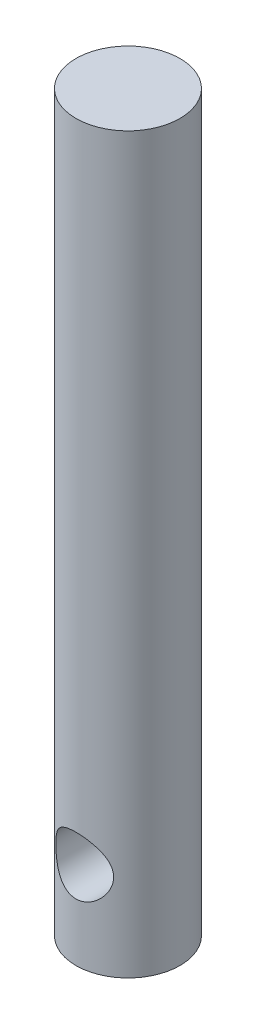
ISO-10303-21;
HEADER;
FILE_DESCRIPTION(('STEP AP214'),'2;1');
FILE_NAME('part.step','',(''),(''),'','','');
FILE_SCHEMA(('AUTOMOTIVE_DESIGN { 1 0 10303 214 1 1 1 1 }'));
ENDSEC;
DATA;
#1=APPLICATION_CONTEXT('core data for automotive mechanical design processes');
#2=APPLICATION_PROTOCOL_DEFINITION('international standard','automotive_design',2000,#1);
#3=PRODUCT_CONTEXT('',#1,'mechanical');
#4=PRODUCT('Part','Part','',(#3));
#5=PRODUCT_RELATED_PRODUCT_CATEGORY('part','',(#4));
#6=PRODUCT_DEFINITION_FORMATION('','',#4);
#7=PRODUCT_DEFINITION_CONTEXT('part definition',#1,'design');
#8=PRODUCT_DEFINITION('design','',#6,#7);
#9=PRODUCT_DEFINITION_SHAPE('','',#8);
#10=(LENGTH_UNIT() NAMED_UNIT(*) SI_UNIT(.MILLI.,.METRE.));
#11=(NAMED_UNIT(*) PLANE_ANGLE_UNIT() SI_UNIT($,.RADIAN.));
#12=(NAMED_UNIT(*) SI_UNIT($,.STERADIAN.) SOLID_ANGLE_UNIT());
#13=UNCERTAINTY_MEASURE_WITH_UNIT(LENGTH_MEASURE(1.E-05),#10,'distance_accuracy_value','');
#14=(GEOMETRIC_REPRESENTATION_CONTEXT(3) GLOBAL_UNCERTAINTY_ASSIGNED_CONTEXT((#13)) GLOBAL_UNIT_ASSIGNED_CONTEXT((#10,
#11,#12)) REPRESENTATION_CONTEXT('',''));
#15=CARTESIAN_POINT('',(0.,0.,0.));
#16=DIRECTION('',(0.,0.,1.));
#17=DIRECTION('',(1.,0.,0.));
#18=AXIS2_PLACEMENT_3D('',#15,#16,#17);
#19=CARTESIAN_POINT('',(32.6665114947379,127.,0.));
#20=DIRECTION('',(0.,-1.,0.));
#21=DIRECTION('',(0.,0.,-1.));
#22=AXIS2_PLACEMENT_3D('',#19,#20,#21);
#23=CYLINDRICAL_SURFACE('',#22,9.);
#24=CARTESIAN_POINT('',(32.6665114947379,20.,-9.));
#25=CARTESIAN_POINT('',(32.5367828446391,20.0000004034984,-9.00000035367436));
#26=CARTESIAN_POINT('',(32.4070594209438,19.9949457291585,-8.99718916475519));
#27=CARTESIAN_POINT('',(32.1485899390427,19.9747929956815,-8.98601661845687));
#28=CARTESIAN_POINT('',(32.0198442406236,19.9596914048975,-8.97765330942365));
#29=CARTESIAN_POINT('',(31.7643966779283,19.9196443065761,-8.95559163133401));
#30=CARTESIAN_POINT('',(31.6376942972219,19.8947013282714,-8.94189463304535));
#31=CARTESIAN_POINT('',(31.3871540239864,19.8352693657243,-8.90950110249539));
#32=CARTESIAN_POINT('',(31.2633173329788,19.800776453257,-8.89080251301058));
#33=CARTESIAN_POINT('',(31.0198672429261,19.7227988187131,-8.8489406066893));
#34=CARTESIAN_POINT('',(30.900238461846,19.6793519723011,-8.82579612337895));
#35=CARTESIAN_POINT('',(30.6653313414804,19.5838168431952,-8.77551906926369));
#36=CARTESIAN_POINT('',(30.5500546628547,19.5317253019913,-8.74838499507351));
#37=CARTESIAN_POINT('',(30.2117227207629,19.3631884503319,-8.66187363770961));
#38=CARTESIAN_POINT('',(29.9959773181274,19.2344198818942,-8.59735346727596));
#39=CARTESIAN_POINT('',(29.5737992038572,18.9378076863466,-8.45507241221886));
#40=CARTESIAN_POINT('',(29.3690573350959,18.7678695156046,-8.37670278285859));
#41=CARTESIAN_POINT('',(28.9893515052516,18.3983538741864,-8.21711406392093));
#42=CARTESIAN_POINT('',(28.814417956795,18.1987465168941,-8.13589216491854));
#43=CARTESIAN_POINT('',(28.4813435372587,17.7513058265881,-7.97009263226158));
#44=CARTESIAN_POINT('',(28.3267012137276,17.5006351634021,-7.88600912242673));
#45=CARTESIAN_POINT('',(28.1285911250821,17.1045411217027,-7.77258662819673));
#46=CARTESIAN_POINT('',(28.068200145882,16.9691734216196,-7.73689861013125));
#47=CARTESIAN_POINT('',(27.9593117336566,16.692446845762,-7.67113380801425));
#48=CARTESIAN_POINT('',(27.9108106837584,16.5510898073064,-7.64105531823258));
#49=CARTESIAN_POINT('',(27.8019930079091,16.1799943165465,-7.57250099477048));
#50=CARTESIAN_POINT('',(27.7510582166957,15.9464097803243,-7.53922489494339));
#51=CARTESIAN_POINT('',(27.6831418013948,15.4724996130238,-7.49451395010564));
#52=CARTESIAN_POINT('',(27.6661267085638,15.2321808643583,-7.4830575759562));
#53=CARTESIAN_POINT('',(27.6669098482661,14.7513456479218,-7.48358103631206));
#54=CARTESIAN_POINT('',(27.684746202541,14.5108292516151,-7.49558653424255));
#55=CARTESIAN_POINT('',(27.7543017973533,14.0368419240406,-7.54134329912878));
#56=CARTESIAN_POINT('',(27.8060430702343,13.8033756774211,-7.57510870603263));
#57=CARTESIAN_POINT('',(27.9409581753619,13.3491364552529,-7.65998850707494));
#58=CARTESIAN_POINT('',(28.0241389960293,13.1283663143898,-7.71110675816709));
#59=CARTESIAN_POINT('',(28.2191083189459,12.7031833464194,-7.82517266123029));
#60=CARTESIAN_POINT('',(28.3309079946434,12.4987769490986,-7.88812493091398));
#61=CARTESIAN_POINT('',(28.5995741096628,12.0791797137506,-8.03034742050394));
#62=CARTESIAN_POINT('',(28.7607072995741,11.8670704959665,-8.11064361563464));
#63=CARTESIAN_POINT('',(29.1146098011926,11.4709010721211,-8.2717439652866));
#64=CARTESIAN_POINT('',(29.307404079653,11.2868632247962,-8.3525484718906));
#65=CARTESIAN_POINT('',(29.6283081477755,11.0262203820365,-8.47255594770406));
#66=CARTESIAN_POINT('',(29.7466296846847,10.9384610971818,-8.51415799334353));
#67=CARTESIAN_POINT('',(29.9912929633343,10.7733031325161,-8.59416899062467));
#68=CARTESIAN_POINT('',(30.1176316146917,10.6959004958319,-8.63257915962083));
#69=CARTESIAN_POINT('',(30.377600704546,10.5521979144297,-8.70511911408218));
#70=CARTESIAN_POINT('',(30.5112292314338,10.4858950774127,-8.73925001402194));
#71=CARTESIAN_POINT('',(30.7849303882085,10.3651304371239,-8.80223607285831));
#72=CARTESIAN_POINT('',(30.925002231321,10.31066719278,-8.83109187375265));
#73=CARTESIAN_POINT('',(31.2003965316157,10.2177299675468,-8.88080389711844));
#74=CARTESIAN_POINT('',(31.3353529234199,10.1783968460121,-8.90208189584858));
#75=CARTESIAN_POINT('',(31.60885690389,10.1111154382259,-8.9387020465349));
#76=CARTESIAN_POINT('',(31.7474040202481,10.0831656626629,-8.95404497497797));
#77=CARTESIAN_POINT('',(32.0268233476822,10.0390736483573,-8.97833234249118));
#78=CARTESIAN_POINT('',(32.1676938837986,10.022923253825,-8.98728120107926));
#79=CARTESIAN_POINT('',(32.4505573972594,10.0026543866648,-8.99852157239254));
#80=CARTESIAN_POINT('',(32.5925502628185,9.99853473053409,-9.00081373995796));
#81=CARTESIAN_POINT('',(32.8601728052236,10.0021687734577,-8.99879540596083));
#82=CARTESIAN_POINT('',(32.9858278933045,10.0086261118927,-8.99520578290285));
#83=CARTESIAN_POINT('',(33.2360798324394,10.0309580369905,-8.98283315150499));
#84=CARTESIAN_POINT('',(33.3606763448662,10.0468355299366,-8.97404854042271));
#85=CARTESIAN_POINT('',(33.6078388152261,10.087812709104,-8.95149651046086));
#86=CARTESIAN_POINT('',(33.7304055129656,10.1129089544545,-8.93773095073358));
#87=CARTESIAN_POINT('',(33.9727582430043,10.1720288858661,-8.90554320996941));
#88=CARTESIAN_POINT('',(34.0925431840941,10.2060560129727,-8.88711923415739));
#89=CARTESIAN_POINT('',(34.4456184447404,10.3207136092338,-8.82561614200698));
#90=CARTESIAN_POINT('',(34.6738070237579,10.4141194967415,-8.77619255116919));
#91=CARTESIAN_POINT('',(35.1113995036009,10.6316601669243,-8.66450874935682));
#92=CARTESIAN_POINT('',(35.3207983571972,10.7558031726297,-8.60224510405811));
#93=CARTESIAN_POINT('',(35.7382410737732,11.0458219722926,-8.46272453532919));
#94=CARTESIAN_POINT('',(35.9439193244684,11.2146808556353,-8.38458363909744));
#95=CARTESIAN_POINT('',(36.3255930212739,11.5821867954545,-8.22520611371522));
#96=CARTESIAN_POINT('',(36.5015553912837,11.7808665865338,-8.14396615672224));
#97=CARTESIAN_POINT('',(36.8367497247646,12.2261230952558,-7.97793731767649));
#98=CARTESIAN_POINT('',(36.9925115437944,12.4755084812089,-7.89361512920966));
#99=CARTESIAN_POINT('',(37.2592704110739,13.001689370523,-7.74146523733296));
#100=CARTESIAN_POINT('',(37.370330773016,13.2784454094521,-7.67361425911824));
#101=CARTESIAN_POINT('',(37.5242892430379,13.7924339279546,-7.57683809208937));
#102=CARTESIAN_POINT('',(37.5765692144714,14.0258825344072,-7.54274744656531));
#103=CARTESIAN_POINT('',(37.64719001223,14.4998932849409,-7.49631291383467));
#104=CARTESIAN_POINT('',(37.6655647396964,14.7404480788371,-7.48394730481338));
#105=CARTESIAN_POINT('',(37.6673879113381,15.222043485471,-7.48272923894071));
#106=CARTESIAN_POINT('',(37.6507928750416,15.4630843302881,-7.49390605410459));
#107=CARTESIAN_POINT('',(37.5835442158987,15.9383360755629,-7.53819223511371));
#108=CARTESIAN_POINT('',(37.5328688443958,16.1725425149428,-7.57131560614076));
#109=CARTESIAN_POINT('',(37.4001016918351,16.627637340616,-7.65501053053173));
#110=CARTESIAN_POINT('',(37.3181048273591,16.8485636525451,-7.7055293237003));
#111=CARTESIAN_POINT('',(37.1254983471157,17.2742180217571,-7.81855933555385));
#112=CARTESIAN_POINT('',(37.0148777093441,17.4789397995025,-7.88107517147513));
#113=CARTESIAN_POINT('',(36.7489052842257,17.8991183375095,-8.02246926398218));
#114=CARTESIAN_POINT('',(36.5893248399498,18.1115438786473,-8.10239358916594));
#115=CARTESIAN_POINT('',(36.2385959921648,18.5086152041109,-8.26301218742008));
#116=CARTESIAN_POINT('',(36.0474220871526,18.6932383149827,-8.34370703244943));
#117=CARTESIAN_POINT('',(35.7287734770642,18.9552664708034,-8.46388232404898));
#118=CARTESIAN_POINT('',(35.6110560509239,19.0436910628916,-8.50565265713109));
#119=CARTESIAN_POINT('',(35.367560687459,19.2102335331473,-8.5860784208833));
#120=CARTESIAN_POINT('',(35.2417858314498,19.2883553167594,-8.62473502968511));
#121=CARTESIAN_POINT('',(34.982902640066,19.4335486508301,-8.69784009103004));
#122=CARTESIAN_POINT('',(34.8497967135447,19.5006238024406,-8.73228991401566));
#123=CARTESIAN_POINT('',(34.577079049447,19.6229922280432,-8.79598351699736));
#124=CARTESIAN_POINT('',(34.4374682281901,19.6782871553919,-8.82522802746501));
#125=CARTESIAN_POINT('',(34.1656401994188,19.7719363734518,-8.87524400995768));
#126=CARTESIAN_POINT('',(34.0338906745615,19.8113683212244,-8.89654158296884));
#127=CARTESIAN_POINT('',(33.7668494133089,19.8793680968185,-8.93349970483442));
#128=CARTESIAN_POINT('',(33.6315581519881,19.9079373738153,-8.94916100560194));
#129=CARTESIAN_POINT('',(33.358599819171,19.953802009618,-8.97439622187978));
#130=CARTESIAN_POINT('',(33.2209342606779,19.9711042942135,-8.98397387690143));
#131=CARTESIAN_POINT('',(32.9443475932453,19.9942027849947,-8.99677541735904));
#132=CARTESIAN_POINT('',(32.8054265475917,19.9999995679289,-8.9999996212811));
#133=CARTESIAN_POINT('',(32.6665114947379,20.,-9.));
#134=B_SPLINE_CURVE_WITH_KNOTS('',3,(#24,#25,#26,#27,#28,#29,#30,#31,#32,#33,#34,#35,#36,#37,
#38,#39,#40,#41,#42,#43,#44,#45,#46,#47,#48,#49,#50,#51,#52,#53,#54,#55,#56,#57,#58,#59,#60,#61,
#62,#63,#64,#65,#66,#67,#68,#69,#70,#71,#72,#73,#74,#75,#76,#77,#78,#79,#80,#81,#82,#83,#84,#85,
#86,#87,#88,#89,#90,#91,#92,#93,#94,#95,#96,#97,#98,#99,#100,#101,#102,#103,#104,#105,#106,#107,
#108,#109,#110,#111,#112,#113,#114,#115,#116,#117,#118,#119,#120,#121,#122,#123,#124,#125,#126,
#127,#128,#129,#130,#131,#132,#133),.UNSPECIFIED.,.T.,.F.,(4,2,2,2,2,2,2,2,2,2,2,2,2,2,2,2,2,2,
2,2,2,2,2,2,2,2,2,2,2,2,2,2,2,2,2,2,2,2,2,2,2,2,2,2,2,2,2,2,2,2,2,2,2,2,4),(0.,
0.389049038673792,0.778234906423188,1.16732081864409,1.55656701401969,1.94419928087581,
2.33197799415703,3.10694003691381,3.93579164360748,4.76548390659346,5.67926108729745,
6.13607645300718,6.59275268424475,7.31346839098542,8.03347261109575,8.75426483810453,
9.47552592073735,10.1969474205328,10.9186510103256,11.7500289468904,12.5820656531714,
13.0407937204137,13.4993460219526,13.9577786509196,14.4161554498582,14.8420733324614,
15.2679354732485,15.6935029768355,16.1190286145522,16.496186859017,16.8734615239821,
17.2505955151925,17.6278750290087,18.3788772686742,19.1300806397395,19.9587345054796,
20.7883047338674,21.7014293455293,22.613256047122,23.335047084232,24.0561160257528,
24.778082054147,25.5005092490547,26.220764350684,26.9412972109113,27.7704094124313,
28.6001941523198,29.0588132846799,29.5172580673312,29.9755531019594,30.4337837723652,
30.8507153459595,31.2675912777014,31.6842107144439,32.1008092663359),.UNSPECIFIED.);
#135=CARTESIAN_POINT('',(32.6665114947379,20.,-9.));
#136=VERTEX_POINT('',#135);
#137=EDGE_CURVE('E41',#136,#136,#134,.T.);
#138=ORIENTED_EDGE('',*,*,#137,.T.);
#139=EDGE_LOOP('',(#138));
#140=FACE_BOUND('',#139,.T.);
#141=CARTESIAN_POINT('',(37.6665114947379,15.,7.48331477354789));
#142=CARTESIAN_POINT('',(37.6665131808659,14.8720718292849,7.48331243270645));
#143=CARTESIAN_POINT('',(37.661596053032,14.7441618676988,7.48660574987457));
#144=CARTESIAN_POINT('',(37.6420106872778,14.4893789572325,7.49963659714171));
#145=CARTESIAN_POINT('',(37.6273394247641,14.3625063423729,7.50937612609856));
#146=CARTESIAN_POINT('',(37.588442609149,14.1107082480239,7.53492756878943));
#147=CARTESIAN_POINT('',(37.564206021254,13.9857851912361,7.55074649531046));
#148=CARTESIAN_POINT('',(37.5065224721387,13.7388925149792,7.58784959281152));
#149=CARTESIAN_POINT('',(37.4730713735123,13.6169242490683,7.60913621855172));
#150=CARTESIAN_POINT('',(37.3599961925678,13.2582612525193,7.67978574183441));
#151=CARTESIAN_POINT('',(37.2673491845615,13.0269127051961,7.73614928485831));
#152=CARTESIAN_POINT('',(37.0506316556802,12.5832658302234,7.8609828997943));
#153=CARTESIAN_POINT('',(36.9265541551692,12.3709717481181,7.92945565972794));
#154=CARTESIAN_POINT('',(36.6355209117743,11.9471854751309,8.07938439169734));
#155=CARTESIAN_POINT('',(36.4654600344027,11.7380410446313,8.16145087575439));
#156=CARTESIAN_POINT('',(36.0935478330022,11.3492791212117,8.32445651504934));
#157=CARTESIAN_POINT('',(35.8916771878194,11.1696797102486,8.40539495238047));
#158=CARTESIAN_POINT('',(35.5581817022082,10.9183398980794,8.5237245436681));
#159=CARTESIAN_POINT('',(35.4364192536679,10.834720878775,8.56416494780396));
#160=CARTESIAN_POINT('',(35.1851444946628,10.6781514174861,8.64139626557984));
#161=CARTESIAN_POINT('',(35.0556353743742,10.6051966258869,8.67818866514922));
#162=CARTESIAN_POINT('',(34.7896713787858,10.4707182531401,8.74706012051628));
#163=CARTESIAN_POINT('',(34.653218971502,10.4091906458229,8.77914083555733));
#164=CARTESIAN_POINT('',(34.374286825375,10.298296411558,8.83763516885212));
#165=CARTESIAN_POINT('',(34.2318079111679,10.2489281270585,8.86404955947242));
#166=CARTESIAN_POINT('',(33.9542408233492,10.166688403985,8.90841219292351));
#167=CARTESIAN_POINT('',(33.819544964446,10.132775729582,8.92688709925996));
#168=CARTESIAN_POINT('',(33.5471418826589,10.0761971886586,8.95786090893054));
#169=CARTESIAN_POINT('',(33.4094350371113,10.053529921205,8.97036055664496));
#170=CARTESIAN_POINT('',(33.1322666453844,10.019784034152,8.9890129247515));
#171=CARTESIAN_POINT('',(32.9928062309833,10.0086982927845,8.99516954559615));
#172=CARTESIAN_POINT('',(32.7133162620534,9.99826429303817,9.00096328235762));
#173=CARTESIAN_POINT('',(32.573286754811,9.99891507862174,9.00060092929895));
#174=CARTESIAN_POINT('',(32.3089221195719,10.0112406041568,8.9937589730659));
#175=CARTESIAN_POINT('',(32.1845123553502,10.0217271857681,8.98793869928273));
#176=CARTESIAN_POINT('',(31.9371203161667,10.0519173148915,8.97125208146431));
#177=CARTESIAN_POINT('',(31.814138494307,10.0716237102359,8.96038417831598));
#178=CARTESIAN_POINT('',(31.5705235629492,10.120018135391,8.933857624232));
#179=CARTESIAN_POINT('',(31.4498896783165,10.1487031457372,8.91820058390017));
#180=CARTESIAN_POINT('',(31.2116728574801,10.2147363131196,8.88245387233266));
#181=CARTESIAN_POINT('',(31.0940911178503,10.2520878124226,8.86236249112146));
#182=CARTESIAN_POINT('',(30.7446938649011,10.3774329991721,8.79562517969765));
#183=CARTESIAN_POINT('',(30.5185097897412,10.4782582422032,8.74277577170477));
#184=CARTESIAN_POINT('',(30.0859721867101,10.7103343790074,8.62503641093523));
#185=CARTESIAN_POINT('',(29.8796249167854,10.8415948299534,8.5601426773154));
#186=CARTESIAN_POINT('',(29.4683309470523,11.1471840738587,8.41570683408599));
#187=CARTESIAN_POINT('',(29.2659997345824,11.3246512933881,8.33533893661064));
#188=CARTESIAN_POINT('',(28.8924371716992,11.709337300475,8.1730018262765));
#189=CARTESIAN_POINT('',(28.7212391383363,11.9165875406843,8.09103100070489));
#190=CARTESIAN_POINT('',(28.3991706456088,12.3778412005397,7.92624804992579));
#191=CARTESIAN_POINT('',(28.2515536506977,12.6343804399138,7.84403433178348));
#192=CARTESIAN_POINT('',(28.064854271458,13.0386620441184,7.73498351899427));
#193=CARTESIAN_POINT('',(28.0084018721559,13.1766943506871,7.70100676332582));
#194=CARTESIAN_POINT('',(27.907735669793,13.4584477733661,7.63921059111262));
#195=CARTESIAN_POINT('',(27.8635134912322,13.6021649189073,7.61138696341208));
#196=CARTESIAN_POINT('',(27.7910135449908,13.8825101344798,7.56513200965961));
#197=CARTESIAN_POINT('',(27.7617445262618,14.0187878315539,7.54612808373361));
#198=CARTESIAN_POINT('',(27.7146333364957,14.2940409075964,7.51529770745305));
#199=CARTESIAN_POINT('',(27.696784437474,14.4330146484144,7.50346703130622));
#200=CARTESIAN_POINT('',(27.6728292168278,14.7123073824244,7.48754609042981));
#201=CARTESIAN_POINT('',(27.666713836233,14.8526252536778,7.48344985429394));
#202=CARTESIAN_POINT('',(27.6663190930433,15.1332752160405,7.48318633493305));
#203=CARTESIAN_POINT('',(27.6720383714743,15.273607303667,7.48701814133073));
#204=CARTESIAN_POINT('',(27.6934554105488,15.5318756649396,7.50125622905865));
#205=CARTESIAN_POINT('',(27.7075256293353,15.6500103202308,7.51058874586671));
#206=CARTESIAN_POINT('',(27.743930636772,15.8844730138793,7.53449812964601));
#207=CARTESIAN_POINT('',(27.7662679267109,16.0008004943462,7.54907658379326));
#208=CARTESIAN_POINT('',(27.8453061738946,16.3459518302373,7.59999895162264));
#209=CARTESIAN_POINT('',(27.914045106721,16.571079923426,7.6435381867759));
#210=CARTESIAN_POINT('',(28.0842942494419,17.0155320145019,7.74683834475779));
#211=CARTESIAN_POINT('',(28.1870392366945,17.2342335907062,7.80719429287903));
#212=CARTESIAN_POINT('',(28.4213938744319,17.652639792763,7.93705962571137));
#213=CARTESIAN_POINT('',(28.5530176142632,17.8523350774153,8.00657347173437));
#214=CARTESIAN_POINT('',(28.8661636449774,18.2609795546195,8.16042346556686));
#215=CARTESIAN_POINT('',(29.0523173283056,18.4661704504933,8.2453341921284));
#216=CARTESIAN_POINT('',(29.4571371510782,18.8440219318929,8.41116341865887));
#217=CARTESIAN_POINT('',(29.6758232334081,19.016662415256,8.49207942899204));
#218=CARTESIAN_POINT('',(30.0313437448364,19.2517752888497,8.60654459047302));
#219=CARTESIAN_POINT('',(30.1580387244354,19.3277627198003,8.64441160092824));
#220=CARTESIAN_POINT('',(30.4185972630404,19.4686446554243,8.71579527343903));
#221=CARTESIAN_POINT('',(30.5524575815334,19.5335441198692,8.74931387896152));
#222=CARTESIAN_POINT('',(30.8263980448298,19.6514741426194,8.8109982055522));
#223=CARTESIAN_POINT('',(30.9664744038746,19.7045118093882,8.83916713100797));
#224=CARTESIAN_POINT('',(31.2518311217727,19.7980423274824,8.88929967030503));
#225=CARTESIAN_POINT('',(31.3971106865265,19.8385370840486,8.91126422653184));
#226=CARTESIAN_POINT('',(31.6764390900604,19.9028704362582,8.94636750970624));
#227=CARTESIAN_POINT('',(31.8101085863344,19.9279927033615,8.96018108298179));
#228=CARTESIAN_POINT('',(32.07951954147,19.967289570254,8.98185367551307));
#229=CARTESIAN_POINT('',(32.2152607711146,19.9814653723358,8.98971334870684));
#230=CARTESIAN_POINT('',(32.4876049098197,19.9986599661008,8.99925276317403));
#231=CARTESIAN_POINT('',(32.6242074131205,20.0016836680006,9.00093522424297));
#232=CARTESIAN_POINT('',(32.8971307824358,19.9965430439312,8.99807967611155));
#233=CARTESIAN_POINT('',(33.0334516630167,19.9883793118986,8.99354199713608));
#234=CARTESIAN_POINT('',(33.2920811686771,19.9622530056097,8.97907835524008));
#235=CARTESIAN_POINT('',(33.4145195186381,19.9452666885291,8.96968964144521));
#236=CARTESIAN_POINT('',(33.6573701219692,19.9023900268389,8.94612300520264));
#237=CARTESIAN_POINT('',(33.777781733347,19.8764969145763,8.93194359414207));
#238=CARTESIAN_POINT('',(34.1347127187315,19.7858653440887,8.88267195984858));
#239=CARTESIAN_POINT('',(34.3671532949532,19.7081513439325,8.84083292190673));
#240=CARTESIAN_POINT('',(34.8228456889442,19.5181050792204,8.74108400233929));
#241=CARTESIAN_POINT('',(35.0455447422796,19.404719368837,8.68269129836171));
#242=CARTESIAN_POINT('',(35.4694741161648,19.1478778307882,8.5552586630217));
#243=CARTESIAN_POINT('',(35.6706959284894,19.0044101523577,8.48621453838248));
#244=CARTESIAN_POINT('',(36.070894939865,18.6722471689218,8.33433239933884));
#245=CARTESIAN_POINT('',(36.26688365449,18.4802309976141,8.25082429244305));
#246=CARTESIAN_POINT('',(36.5355451273271,18.170072684499,8.12652435608709));
#247=CARTESIAN_POINT('',(36.6209494184014,18.0628824609679,8.08521168619209));
#248=CARTESIAN_POINT('',(36.7829317779752,17.84145897559,8.00395385460267));
#249=CARTESIAN_POINT('',(36.8595082839068,17.7272244723415,7.9640089358849));
#250=CARTESIAN_POINT('',(37.0084347805576,17.4838441215351,7.88386707615332));
#251=CARTESIAN_POINT('',(37.080096735597,17.3542155939272,7.84385429718774));
#252=CARTESIAN_POINT('',(37.2120238574231,17.0881452807601,7.7681465397299));
#253=CARTESIAN_POINT('',(37.2722947577281,16.9517069667568,7.73244939230646));
#254=CARTESIAN_POINT('',(37.3806437299241,16.6730930632395,7.66687445970634));
#255=CARTESIAN_POINT('',(37.4287505399425,16.5309319337913,7.63698299789825));
#256=CARTESIAN_POINT('',(37.5122093242747,16.2417110340955,7.58430305235848));
#257=CARTESIAN_POINT('',(37.5475693166889,16.0946544070744,7.56151010469755));
#258=CARTESIAN_POINT('',(37.6060949947756,15.7908274166896,7.52341637226572));
#259=CARTESIAN_POINT('',(37.6287044132619,15.6339055107126,7.5084591340159));
#260=CARTESIAN_POINT('',(37.6589112195063,15.3179796228808,7.48841004941368));
#261=CARTESIAN_POINT('',(37.6665093993945,15.1589757513353,7.48331768250081));
#262=CARTESIAN_POINT('',(37.6665114947379,15.,7.48331477354789));
#263=B_SPLINE_CURVE_WITH_KNOTS('',3,(#141,#142,#143,#144,#145,#146,#147,#148,#149,#150,#151,
#152,#153,#154,#155,#156,#157,#158,#159,#160,#161,#162,#163,#164,#165,#166,#167,#168,#169,#170,
#171,#172,#173,#174,#175,#176,#177,#178,#179,#180,#181,#182,#183,#184,#185,#186,#187,#188,#189,
#190,#191,#192,#193,#194,#195,#196,#197,#198,#199,#200,#201,#202,#203,#204,#205,#206,#207,#208,
#209,#210,#211,#212,#213,#214,#215,#216,#217,#218,#219,#220,#221,#222,#223,#224,#225,#226,#227,
#228,#229,#230,#231,#232,#233,#234,#235,#236,#237,#238,#239,#240,#241,#242,#243,#244,#245,#246,
#247,#248,#249,#250,#251,#252,#253,#254,#255,#256,#257,#258,#259,#260,#261,#262),.UNSPECIFIED.,
.T.,.F.,(4,2,2,2,2,2,2,2,2,2,2,2,2,2,2,2,2,2,2,2,2,2,2,2,2,2,2,2,2,2,2,2,2,2,2,2,2,2,2,2,2,2,2,
2,2,2,2,2,2,2,2,2,2,2,2,2,2,2,2,2,4),(0.,0.383617262434556,0.767353533654932,1.15153379253866,
1.53588683411636,2.29887381256896,3.06203037306044,3.90401345702823,4.74650994436255,
5.20543330239272,5.66416895408678,6.12274267036475,6.58125383950371,7.00103463233334,
7.42076311645811,7.84023334691959,8.25966940820446,8.63418281341921,9.00881197544206,
9.38331528661349,9.75796326728324,10.5142082489873,11.2706910268593,12.1098131090736,
12.9498279570035,13.8660549484084,14.3243316832876,14.7822937995549,15.2036849882509,
15.6248276917814,16.0456451171919,16.4664142228104,16.8239929217894,17.1816798984961,
17.8966505229979,18.6411117273933,19.3859369498883,20.2516469645331,21.1178898770868,
21.5748932590507,22.0316916800074,22.4882156157593,22.9446701724715,23.3542362432264,
23.7637573233568,24.1730980717718,24.5824170892821,24.9538736149231,25.3254456695292,
26.0679180989854,26.8347832325739,27.6019510415397,28.4584307032008,28.8875063562192,
29.3166578418249,29.7763339243287,30.2357780158996,30.6941262921722,31.1521857495434,
31.6289303211718,32.1056497347289),.UNSPECIFIED.);
#264=CARTESIAN_POINT('',(37.6665114947379,15.,7.48331477354789));
#265=VERTEX_POINT('',#264);
#266=EDGE_CURVE('E10',#265,#265,#263,.T.);
#267=ORIENTED_EDGE('',*,*,#266,.T.);
#268=EDGE_LOOP('',(#267));
#269=FACE_BOUND('',#268,.T.);
#270=CARTESIAN_POINT('',(32.6665114947379,127.,0.));
#271=DIRECTION('',(0.,1.,0.));
#272=DIRECTION('',(0.,0.,1.));
#273=AXIS2_PLACEMENT_3D('',#270,#271,#272);
#274=CIRCLE('',#273,9.);
#275=CARTESIAN_POINT('',(32.6665114947379,127.,9.));
#276=VERTEX_POINT('',#275);
#277=EDGE_CURVE('E47',#276,#276,#274,.T.);
#278=ORIENTED_EDGE('',*,*,#277,.F.);
#279=EDGE_LOOP('',(#278));
#280=FACE_BOUND('',#279,.T.);
#281=CARTESIAN_POINT('',(32.6665114947379,0.,0.));
#282=DIRECTION('',(0.,1.,0.));
#283=DIRECTION('',(0.,0.,1.));
#284=AXIS2_PLACEMENT_3D('',#281,#282,#283);
#285=CIRCLE('',#284,9.);
#286=CARTESIAN_POINT('',(32.6665114947379,0.,9.));
#287=VERTEX_POINT('',#286);
#288=EDGE_CURVE('E52',#287,#287,#285,.T.);
#289=ORIENTED_EDGE('',*,*,#288,.T.);
#290=EDGE_LOOP('',(#289));
#291=FACE_BOUND('',#290,.T.);
#292=ADVANCED_FACE('F40',(#140,#269,#280,#291),#23,.T.);
#293=CARTESIAN_POINT('',(32.6665114947379,127.,0.));
#294=DIRECTION('',(0.,1.,0.));
#295=DIRECTION('',(0.,0.,1.));
#296=AXIS2_PLACEMENT_3D('',#293,#294,#295);
#297=PLANE('',#296);
#298=ORIENTED_EDGE('',*,*,#277,.T.);
#299=EDGE_LOOP('',(#298));
#300=FACE_BOUND('',#299,.T.);
#301=ADVANCED_FACE('F64',(#300),#297,.T.);
#302=CARTESIAN_POINT('',(32.6665114947379,0.,0.));
#303=DIRECTION('',(0.,1.,0.));
#304=DIRECTION('',(0.,0.,1.));
#305=AXIS2_PLACEMENT_3D('',#302,#303,#304);
#306=PLANE('',#305);
#307=ORIENTED_EDGE('',*,*,#288,.F.);
#308=EDGE_LOOP('',(#307));
#309=FACE_BOUND('',#308,.T.);
#310=ADVANCED_FACE('F62',(#309),#306,.F.);
#311=CARTESIAN_POINT('',(32.6665114947379,15.,-41.));
#312=DIRECTION('',(0.,0.,1.));
#313=DIRECTION('',(1.,0.,0.));
#314=AXIS2_PLACEMENT_3D('',#311,#312,#313);
#315=CYLINDRICAL_SURFACE('',#314,5.);
#316=ORIENTED_EDGE('',*,*,#266,.F.);
#317=EDGE_LOOP('',(#316));
#318=FACE_BOUND('',#317,.T.);
#319=ORIENTED_EDGE('',*,*,#137,.F.);
#320=EDGE_LOOP('',(#319));
#321=FACE_BOUND('',#320,.T.);
#322=ADVANCED_FACE('F56',(#318,#321),#315,.F.);
#323=CLOSED_SHELL('',(#292,#301,#310,#322));
#324=MANIFOLD_SOLID_BREP('B2',#323);
#325=ADVANCED_BREP_SHAPE_REPRESENTATION('',(#18,#324),#14);
#326=SHAPE_DEFINITION_REPRESENTATION(#9,#325);
ENDSEC;
END-ISO-10303-21;
